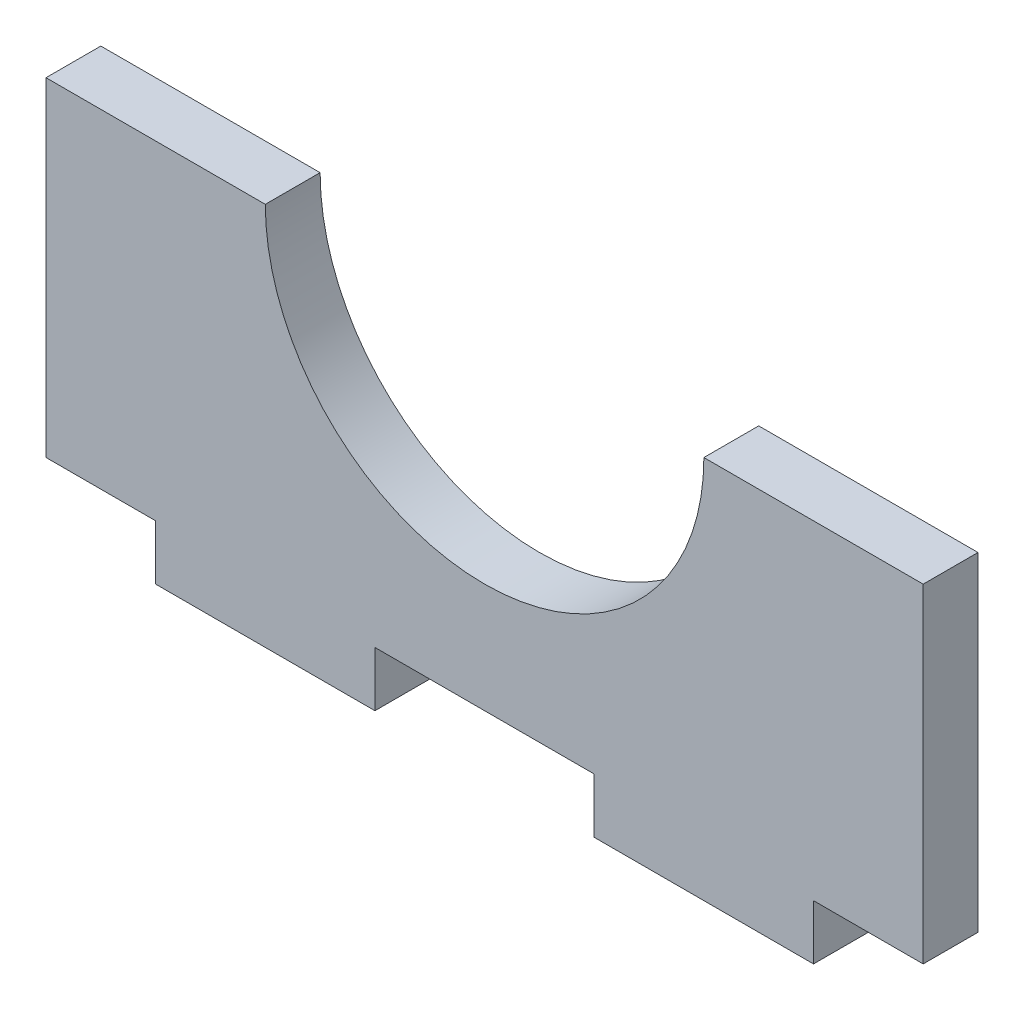
ISO-10303-21;
HEADER;
FILE_DESCRIPTION(('STEP AP214'),'2;1');
FILE_NAME('part.step','',(''),(''),'','','');
FILE_SCHEMA(('AUTOMOTIVE_DESIGN { 1 0 10303 214 1 1 1 1 }'));
ENDSEC;
DATA;
#1=APPLICATION_CONTEXT('core data for automotive mechanical design processes');
#2=APPLICATION_PROTOCOL_DEFINITION('international standard','automotive_design',2000,#1);
#3=PRODUCT_CONTEXT('',#1,'mechanical');
#4=PRODUCT('Part','Part','',(#3));
#5=PRODUCT_RELATED_PRODUCT_CATEGORY('part','',(#4));
#6=PRODUCT_DEFINITION_FORMATION('','',#4);
#7=PRODUCT_DEFINITION_CONTEXT('part definition',#1,'design');
#8=PRODUCT_DEFINITION('design','',#6,#7);
#9=PRODUCT_DEFINITION_SHAPE('','',#8);
#10=(LENGTH_UNIT() NAMED_UNIT(*) SI_UNIT(.MILLI.,.METRE.));
#11=(NAMED_UNIT(*) PLANE_ANGLE_UNIT() SI_UNIT($,.RADIAN.));
#12=(NAMED_UNIT(*) SI_UNIT($,.STERADIAN.) SOLID_ANGLE_UNIT());
#13=UNCERTAINTY_MEASURE_WITH_UNIT(LENGTH_MEASURE(1.E-05),#10,'distance_accuracy_value','');
#14=(GEOMETRIC_REPRESENTATION_CONTEXT(3) GLOBAL_UNCERTAINTY_ASSIGNED_CONTEXT((#13)) GLOBAL_UNIT_ASSIGNED_CONTEXT((#10,
#11,#12)) REPRESENTATION_CONTEXT('',''));
#15=CARTESIAN_POINT('',(0.,0.,0.));
#16=DIRECTION('',(0.,0.,1.));
#17=DIRECTION('',(1.,0.,0.));
#18=AXIS2_PLACEMENT_3D('',#15,#16,#17);
#19=CARTESIAN_POINT('',(0.,0.,3.175));
#20=DIRECTION('',(0.,0.,-1.));
#21=DIRECTION('',(-1.,0.,0.));
#22=AXIS2_PLACEMENT_3D('',#19,#20,#21);
#23=CYLINDRICAL_SURFACE('',#22,12.7);
#24=CARTESIAN_POINT('',(0.,0.,0.));
#25=DIRECTION('',(0.,0.,-1.));
#26=DIRECTION('',(-1.,0.,0.));
#27=AXIS2_PLACEMENT_3D('',#24,#25,#26);
#28=CIRCLE('',#27,12.7);
#29=CARTESIAN_POINT('',(12.7,0.,0.));
#30=VERTEX_POINT('',#29);
#31=CARTESIAN_POINT('',(-12.7,0.,0.));
#32=VERTEX_POINT('',#31);
#33=EDGE_CURVE('E165',#30,#32,#28,.T.);
#34=ORIENTED_EDGE('',*,*,#33,.T.);
#35=DIRECTION('',(0.,0.,-1.));
#36=VECTOR('',#35,1.);
#37=CARTESIAN_POINT('',(-12.7,0.,3.175));
#38=LINE('',#37,#36);
#39=CARTESIAN_POINT('',(-12.7,0.,3.175));
#40=VERTEX_POINT('',#39);
#41=EDGE_CURVE('E11',#40,#32,#38,.T.);
#42=ORIENTED_EDGE('',*,*,#41,.F.);
#43=CARTESIAN_POINT('',(0.,0.,3.175));
#44=DIRECTION('',(0.,0.,-1.));
#45=DIRECTION('',(-1.,0.,0.));
#46=AXIS2_PLACEMENT_3D('',#43,#44,#45);
#47=CIRCLE('',#46,12.7);
#48=CARTESIAN_POINT('',(12.7,0.,3.175));
#49=VERTEX_POINT('',#48);
#50=EDGE_CURVE('E191',#49,#40,#47,.T.);
#51=ORIENTED_EDGE('',*,*,#50,.F.);
#52=DIRECTION('',(0.,0.,-1.));
#53=VECTOR('',#52,1.);
#54=CARTESIAN_POINT('',(12.7,0.,3.175));
#55=LINE('',#54,#53);
#56=EDGE_CURVE('E161',#49,#30,#55,.T.);
#57=ORIENTED_EDGE('',*,*,#56,.T.);
#58=EDGE_LOOP('',(#34,#42,#51,#57));
#59=FACE_BOUND('',#58,.T.);
#60=ADVANCED_FACE('F33',(#59),#23,.F.);
#61=CARTESIAN_POINT('',(-12.7,0.,3.175));
#62=DIRECTION('',(0.,-1.,0.));
#63=DIRECTION('',(1.,0.,0.));
#64=AXIS2_PLACEMENT_3D('',#61,#62,#63);
#65=PLANE('',#64);
#66=DIRECTION('',(-1.,0.,0.));
#67=VECTOR('',#66,1.);
#68=CARTESIAN_POINT('',(-12.7,0.,0.));
#69=LINE('',#68,#67);
#70=CARTESIAN_POINT('',(-25.4,0.,0.));
#71=VERTEX_POINT('',#70);
#72=EDGE_CURVE('E168',#32,#71,#69,.T.);
#73=ORIENTED_EDGE('',*,*,#72,.T.);
#74=DIRECTION('',(0.,0.,-1.));
#75=VECTOR('',#74,1.);
#76=CARTESIAN_POINT('',(-25.4,0.,3.175));
#77=LINE('',#76,#75);
#78=CARTESIAN_POINT('',(-25.4,0.,3.175));
#79=VERTEX_POINT('',#78);
#80=EDGE_CURVE('E41',#79,#71,#77,.T.);
#81=ORIENTED_EDGE('',*,*,#80,.F.);
#82=DIRECTION('',(-1.,0.,0.));
#83=VECTOR('',#82,1.);
#84=CARTESIAN_POINT('',(-12.7,0.,3.175));
#85=LINE('',#84,#83);
#86=EDGE_CURVE('E110',#40,#79,#85,.T.);
#87=ORIENTED_EDGE('',*,*,#86,.F.);
#88=ORIENTED_EDGE('',*,*,#41,.T.);
#89=EDGE_LOOP('',(#73,#81,#87,#88));
#90=FACE_BOUND('',#89,.T.);
#91=ADVANCED_FACE('F279',(#90),#65,.F.);
#92=CARTESIAN_POINT('',(-25.4,0.,3.175));
#93=DIRECTION('',(1.,0.,0.));
#94=DIRECTION('',(0.,1.,0.));
#95=AXIS2_PLACEMENT_3D('',#92,#93,#94);
#96=PLANE('',#95);
#97=DIRECTION('',(0.,-1.,0.));
#98=VECTOR('',#97,1.);
#99=CARTESIAN_POINT('',(-25.4,0.,0.));
#100=LINE('',#99,#98);
#101=CARTESIAN_POINT('',(-25.4,-19.05,0.));
#102=VERTEX_POINT('',#101);
#103=EDGE_CURVE('E170',#71,#102,#100,.T.);
#104=ORIENTED_EDGE('',*,*,#103,.T.);
#105=DIRECTION('',(0.,0.,-1.));
#106=VECTOR('',#105,1.);
#107=CARTESIAN_POINT('',(-25.4,-19.05,3.175));
#108=LINE('',#107,#106);
#109=CARTESIAN_POINT('',(-25.4,-19.05,3.175));
#110=VERTEX_POINT('',#109);
#111=EDGE_CURVE('E216',#110,#102,#108,.T.);
#112=ORIENTED_EDGE('',*,*,#111,.F.);
#113=DIRECTION('',(0.,-1.,0.));
#114=VECTOR('',#113,1.);
#115=CARTESIAN_POINT('',(-25.4,0.,3.175));
#116=LINE('',#115,#114);
#117=EDGE_CURVE('E224',#79,#110,#116,.T.);
#118=ORIENTED_EDGE('',*,*,#117,.F.);
#119=ORIENTED_EDGE('',*,*,#80,.T.);
#120=EDGE_LOOP('',(#104,#112,#118,#119));
#121=FACE_BOUND('',#120,.T.);
#122=ADVANCED_FACE('F222',(#121),#96,.F.);
#123=CARTESIAN_POINT('',(-25.4,-19.05,3.175));
#124=DIRECTION('',(0.,1.,0.));
#125=DIRECTION('',(-1.,0.,0.));
#126=AXIS2_PLACEMENT_3D('',#123,#124,#125);
#127=PLANE('',#126);
#128=DIRECTION('',(1.,0.,0.));
#129=VECTOR('',#128,1.);
#130=CARTESIAN_POINT('',(-25.4,-19.05,0.));
#131=LINE('',#130,#129);
#132=CARTESIAN_POINT('',(-19.05,-19.05,0.));
#133=VERTEX_POINT('',#132);
#134=EDGE_CURVE('E172',#102,#133,#131,.T.);
#135=ORIENTED_EDGE('',*,*,#134,.T.);
#136=DIRECTION('',(0.,0.,-1.));
#137=VECTOR('',#136,1.);
#138=CARTESIAN_POINT('',(-19.05,-19.05,3.175));
#139=LINE('',#138,#137);
#140=CARTESIAN_POINT('',(-19.05,-19.05,3.175));
#141=VERTEX_POINT('',#140);
#142=EDGE_CURVE('E213',#141,#133,#139,.T.);
#143=ORIENTED_EDGE('',*,*,#142,.F.);
#144=DIRECTION('',(1.,0.,0.));
#145=VECTOR('',#144,1.);
#146=CARTESIAN_POINT('',(-25.4,-19.05,3.175));
#147=LINE('',#146,#145);
#148=EDGE_CURVE('E242',#110,#141,#147,.T.);
#149=ORIENTED_EDGE('',*,*,#148,.F.);
#150=ORIENTED_EDGE('',*,*,#111,.T.);
#151=EDGE_LOOP('',(#135,#143,#149,#150));
#152=FACE_BOUND('',#151,.T.);
#153=ADVANCED_FACE('F233',(#152),#127,.F.);
#154=CARTESIAN_POINT('',(-19.05,-19.05,3.175));
#155=DIRECTION('',(1.,0.,0.));
#156=DIRECTION('',(0.,0.,-1.));
#157=AXIS2_PLACEMENT_3D('',#154,#155,#156);
#158=PLANE('',#157);
#159=DIRECTION('',(0.,-1.,0.));
#160=VECTOR('',#159,1.);
#161=CARTESIAN_POINT('',(-19.05,-19.05,0.));
#162=LINE('',#161,#160);
#163=CARTESIAN_POINT('',(-19.05,-22.225,0.));
#164=VERTEX_POINT('',#163);
#165=EDGE_CURVE('E174',#133,#164,#162,.T.);
#166=ORIENTED_EDGE('',*,*,#165,.T.);
#167=DIRECTION('',(0.,0.,-1.));
#168=VECTOR('',#167,1.);
#169=CARTESIAN_POINT('',(-19.05,-22.225,3.175));
#170=LINE('',#169,#168);
#171=CARTESIAN_POINT('',(-19.05,-22.225,3.175));
#172=VERTEX_POINT('',#171);
#173=EDGE_CURVE('E210',#172,#164,#170,.T.);
#174=ORIENTED_EDGE('',*,*,#173,.F.);
#175=DIRECTION('',(0.,-1.,0.));
#176=VECTOR('',#175,1.);
#177=CARTESIAN_POINT('',(-19.05,-19.05,3.175));
#178=LINE('',#177,#176);
#179=EDGE_CURVE('E239',#141,#172,#178,.T.);
#180=ORIENTED_EDGE('',*,*,#179,.F.);
#181=ORIENTED_EDGE('',*,*,#142,.T.);
#182=EDGE_LOOP('',(#166,#174,#180,#181));
#183=FACE_BOUND('',#182,.T.);
#184=ADVANCED_FACE('F237',(#183),#158,.F.);
#185=CARTESIAN_POINT('',(-19.05,-22.225,3.175));
#186=DIRECTION('',(0.,1.,0.));
#187=DIRECTION('',(0.,0.,1.));
#188=AXIS2_PLACEMENT_3D('',#185,#186,#187);
#189=PLANE('',#188);
#190=DIRECTION('',(1.,0.,0.));
#191=VECTOR('',#190,1.);
#192=CARTESIAN_POINT('',(-19.05,-22.225,0.));
#193=LINE('',#192,#191);
#194=CARTESIAN_POINT('',(-6.35,-22.225,0.));
#195=VERTEX_POINT('',#194);
#196=EDGE_CURVE('E176',#164,#195,#193,.T.);
#197=ORIENTED_EDGE('',*,*,#196,.T.);
#198=DIRECTION('',(0.,0.,-1.));
#199=VECTOR('',#198,1.);
#200=CARTESIAN_POINT('',(-6.35,-22.225,3.175));
#201=LINE('',#200,#199);
#202=CARTESIAN_POINT('',(-6.35,-22.225,3.175));
#203=VERTEX_POINT('',#202);
#204=EDGE_CURVE('E207',#203,#195,#201,.T.);
#205=ORIENTED_EDGE('',*,*,#204,.F.);
#206=DIRECTION('',(1.,0.,0.));
#207=VECTOR('',#206,1.);
#208=CARTESIAN_POINT('',(-19.05,-22.225,3.175));
#209=LINE('',#208,#207);
#210=EDGE_CURVE('E241',#172,#203,#209,.T.);
#211=ORIENTED_EDGE('',*,*,#210,.F.);
#212=ORIENTED_EDGE('',*,*,#173,.T.);
#213=EDGE_LOOP('',(#197,#205,#211,#212));
#214=FACE_BOUND('',#213,.T.);
#215=ADVANCED_FACE('F292',(#214),#189,.F.);
#216=CARTESIAN_POINT('',(-6.35,-22.225,3.175));
#217=DIRECTION('',(-1.,0.,0.));
#218=DIRECTION('',(0.,0.,1.));
#219=AXIS2_PLACEMENT_3D('',#216,#217,#218);
#220=PLANE('',#219);
#221=DIRECTION('',(0.,1.,0.));
#222=VECTOR('',#221,1.);
#223=CARTESIAN_POINT('',(-6.35,-22.225,0.));
#224=LINE('',#223,#222);
#225=CARTESIAN_POINT('',(-6.35,-19.05,0.));
#226=VERTEX_POINT('',#225);
#227=EDGE_CURVE('E178',#195,#226,#224,.T.);
#228=ORIENTED_EDGE('',*,*,#227,.T.);
#229=DIRECTION('',(0.,0.,-1.));
#230=VECTOR('',#229,1.);
#231=CARTESIAN_POINT('',(-6.35,-19.05,3.175));
#232=LINE('',#231,#230);
#233=CARTESIAN_POINT('',(-6.35,-19.05,3.175));
#234=VERTEX_POINT('',#233);
#235=EDGE_CURVE('E204',#234,#226,#232,.T.);
#236=ORIENTED_EDGE('',*,*,#235,.F.);
#237=DIRECTION('',(0.,1.,0.));
#238=VECTOR('',#237,1.);
#239=CARTESIAN_POINT('',(-6.35,-22.225,3.175));
#240=LINE('',#239,#238);
#241=EDGE_CURVE('E244',#203,#234,#240,.T.);
#242=ORIENTED_EDGE('',*,*,#241,.F.);
#243=ORIENTED_EDGE('',*,*,#204,.T.);
#244=EDGE_LOOP('',(#228,#236,#242,#243));
#245=FACE_BOUND('',#244,.T.);
#246=ADVANCED_FACE('F295',(#245),#220,.F.);
#247=CARTESIAN_POINT('',(-6.35,-19.05,3.175));
#248=DIRECTION('',(0.,1.,0.));
#249=DIRECTION('',(0.,0.,1.));
#250=AXIS2_PLACEMENT_3D('',#247,#248,#249);
#251=PLANE('',#250);
#252=DIRECTION('',(1.,0.,0.));
#253=VECTOR('',#252,1.);
#254=CARTESIAN_POINT('',(-6.35,-19.05,0.));
#255=LINE('',#254,#253);
#256=CARTESIAN_POINT('',(6.35,-19.05,0.));
#257=VERTEX_POINT('',#256);
#258=EDGE_CURVE('E180',#226,#257,#255,.T.);
#259=ORIENTED_EDGE('',*,*,#258,.T.);
#260=DIRECTION('',(0.,0.,-1.));
#261=VECTOR('',#260,1.);
#262=CARTESIAN_POINT('',(6.35,-19.05,3.175));
#263=LINE('',#262,#261);
#264=CARTESIAN_POINT('',(6.35,-19.05,3.175));
#265=VERTEX_POINT('',#264);
#266=EDGE_CURVE('E201',#265,#257,#263,.T.);
#267=ORIENTED_EDGE('',*,*,#266,.F.);
#268=DIRECTION('',(1.,0.,0.));
#269=VECTOR('',#268,1.);
#270=CARTESIAN_POINT('',(-6.35,-19.05,3.175));
#271=LINE('',#270,#269);
#272=EDGE_CURVE('E250',#234,#265,#271,.T.);
#273=ORIENTED_EDGE('',*,*,#272,.F.);
#274=ORIENTED_EDGE('',*,*,#235,.T.);
#275=EDGE_LOOP('',(#259,#267,#273,#274));
#276=FACE_BOUND('',#275,.T.);
#277=ADVANCED_FACE('F299',(#276),#251,.F.);
#278=CARTESIAN_POINT('',(6.35,-19.05,3.175));
#279=DIRECTION('',(1.,0.,0.));
#280=DIRECTION('',(0.,0.,-1.));
#281=AXIS2_PLACEMENT_3D('',#278,#279,#280);
#282=PLANE('',#281);
#283=DIRECTION('',(0.,-1.,0.));
#284=VECTOR('',#283,1.);
#285=CARTESIAN_POINT('',(6.35,-19.05,0.));
#286=LINE('',#285,#284);
#287=CARTESIAN_POINT('',(6.35,-22.225,0.));
#288=VERTEX_POINT('',#287);
#289=EDGE_CURVE('E182',#257,#288,#286,.T.);
#290=ORIENTED_EDGE('',*,*,#289,.T.);
#291=DIRECTION('',(0.,0.,-1.));
#292=VECTOR('',#291,1.);
#293=CARTESIAN_POINT('',(6.35,-22.225,3.175));
#294=LINE('',#293,#292);
#295=CARTESIAN_POINT('',(6.35,-22.225,3.175));
#296=VERTEX_POINT('',#295);
#297=EDGE_CURVE('E198',#296,#288,#294,.T.);
#298=ORIENTED_EDGE('',*,*,#297,.F.);
#299=DIRECTION('',(0.,-1.,0.));
#300=VECTOR('',#299,1.);
#301=CARTESIAN_POINT('',(6.35,-19.05,3.175));
#302=LINE('',#301,#300);
#303=EDGE_CURVE('E252',#265,#296,#302,.T.);
#304=ORIENTED_EDGE('',*,*,#303,.F.);
#305=ORIENTED_EDGE('',*,*,#266,.T.);
#306=EDGE_LOOP('',(#290,#298,#304,#305));
#307=FACE_BOUND('',#306,.T.);
#308=ADVANCED_FACE('F303',(#307),#282,.F.);
#309=CARTESIAN_POINT('',(19.05,-22.225,3.175));
#310=DIRECTION('',(0.,1.,0.));
#311=DIRECTION('',(0.,0.,1.));
#312=AXIS2_PLACEMENT_3D('',#309,#310,#311);
#313=PLANE('',#312);
#314=DIRECTION('',(1.,0.,0.));
#315=VECTOR('',#314,1.);
#316=CARTESIAN_POINT('',(19.05,-22.225,0.));
#317=LINE('',#316,#315);
#318=CARTESIAN_POINT('',(19.05,-22.225,0.));
#319=VERTEX_POINT('',#318);
#320=EDGE_CURVE('E184',#288,#319,#317,.T.);
#321=ORIENTED_EDGE('',*,*,#320,.T.);
#322=DIRECTION('',(0.,0.,-1.));
#323=VECTOR('',#322,1.);
#324=CARTESIAN_POINT('',(19.05,-22.225,3.175));
#325=LINE('',#324,#323);
#326=CARTESIAN_POINT('',(19.05,-22.225,3.175));
#327=VERTEX_POINT('',#326);
#328=EDGE_CURVE('E195',#327,#319,#325,.T.);
#329=ORIENTED_EDGE('',*,*,#328,.F.);
#330=DIRECTION('',(1.,0.,0.));
#331=VECTOR('',#330,1.);
#332=CARTESIAN_POINT('',(19.05,-22.225,3.175));
#333=LINE('',#332,#331);
#334=EDGE_CURVE('E254',#296,#327,#333,.T.);
#335=ORIENTED_EDGE('',*,*,#334,.F.);
#336=ORIENTED_EDGE('',*,*,#297,.T.);
#337=EDGE_LOOP('',(#321,#329,#335,#336));
#338=FACE_BOUND('',#337,.T.);
#339=ADVANCED_FACE('F260',(#338),#313,.F.);
#340=CARTESIAN_POINT('',(19.05,-19.05,3.175));
#341=DIRECTION('',(-1.,0.,0.));
#342=DIRECTION('',(0.,0.,1.));
#343=AXIS2_PLACEMENT_3D('',#340,#341,#342);
#344=PLANE('',#343);
#345=DIRECTION('',(0.,1.,0.));
#346=VECTOR('',#345,1.);
#347=CARTESIAN_POINT('',(19.05,-19.05,0.));
#348=LINE('',#347,#346);
#349=CARTESIAN_POINT('',(19.05,-19.05,0.));
#350=VERTEX_POINT('',#349);
#351=EDGE_CURVE('E186',#319,#350,#348,.T.);
#352=ORIENTED_EDGE('',*,*,#351,.T.);
#353=DIRECTION('',(0.,0.,-1.));
#354=VECTOR('',#353,1.);
#355=CARTESIAN_POINT('',(19.05,-19.05,3.175));
#356=LINE('',#355,#354);
#357=CARTESIAN_POINT('',(19.05,-19.05,3.175));
#358=VERTEX_POINT('',#357);
#359=EDGE_CURVE('E156',#358,#350,#356,.T.);
#360=ORIENTED_EDGE('',*,*,#359,.F.);
#361=DIRECTION('',(0.,1.,0.));
#362=VECTOR('',#361,1.);
#363=CARTESIAN_POINT('',(19.05,-19.05,3.175));
#364=LINE('',#363,#362);
#365=EDGE_CURVE('E147',#327,#358,#364,.T.);
#366=ORIENTED_EDGE('',*,*,#365,.F.);
#367=ORIENTED_EDGE('',*,*,#328,.T.);
#368=EDGE_LOOP('',(#352,#360,#366,#367));
#369=FACE_BOUND('',#368,.T.);
#370=ADVANCED_FACE('F264',(#369),#344,.F.);
#371=CARTESIAN_POINT('',(25.4,-19.05,3.175));
#372=DIRECTION('',(0.,1.,0.));
#373=DIRECTION('',(-1.,0.,0.));
#374=AXIS2_PLACEMENT_3D('',#371,#372,#373);
#375=PLANE('',#374);
#376=DIRECTION('',(1.,0.,0.));
#377=VECTOR('',#376,1.);
#378=CARTESIAN_POINT('',(25.4,-19.05,0.));
#379=LINE('',#378,#377);
#380=CARTESIAN_POINT('',(25.4,-19.05,0.));
#381=VERTEX_POINT('',#380);
#382=EDGE_CURVE('E155',#350,#381,#379,.T.);
#383=ORIENTED_EDGE('',*,*,#382,.T.);
#384=DIRECTION('',(0.,0.,-1.));
#385=VECTOR('',#384,1.);
#386=CARTESIAN_POINT('',(25.4,-19.05,3.175));
#387=LINE('',#386,#385);
#388=CARTESIAN_POINT('',(25.4,-19.05,3.175));
#389=VERTEX_POINT('',#388);
#390=EDGE_CURVE('E152',#389,#381,#387,.T.);
#391=ORIENTED_EDGE('',*,*,#390,.F.);
#392=DIRECTION('',(1.,0.,0.));
#393=VECTOR('',#392,1.);
#394=CARTESIAN_POINT('',(25.4,-19.05,3.175));
#395=LINE('',#394,#393);
#396=EDGE_CURVE('E141',#358,#389,#395,.T.);
#397=ORIENTED_EDGE('',*,*,#396,.F.);
#398=ORIENTED_EDGE('',*,*,#359,.T.);
#399=EDGE_LOOP('',(#383,#391,#397,#398));
#400=FACE_BOUND('',#399,.T.);
#401=ADVANCED_FACE('F153',(#400),#375,.F.);
#402=CARTESIAN_POINT('',(25.4,-19.05,3.175));
#403=DIRECTION('',(-1.,0.,0.));
#404=DIRECTION('',(0.,-1.,0.));
#405=AXIS2_PLACEMENT_3D('',#402,#403,#404);
#406=PLANE('',#405);
#407=DIRECTION('',(0.,1.,0.));
#408=VECTOR('',#407,1.);
#409=CARTESIAN_POINT('',(25.4,-19.05,0.));
#410=LINE('',#409,#408);
#411=CARTESIAN_POINT('',(25.4,0.,0.));
#412=VERTEX_POINT('',#411);
#413=EDGE_CURVE('E96',#381,#412,#410,.T.);
#414=ORIENTED_EDGE('',*,*,#413,.T.);
#415=DIRECTION('',(0.,0.,-1.));
#416=VECTOR('',#415,1.);
#417=CARTESIAN_POINT('',(25.4,0.,3.175));
#418=LINE('',#417,#416);
#419=CARTESIAN_POINT('',(25.4,0.,3.175));
#420=VERTEX_POINT('',#419);
#421=EDGE_CURVE('E157',#420,#412,#418,.T.);
#422=ORIENTED_EDGE('',*,*,#421,.F.);
#423=DIRECTION('',(0.,1.,0.));
#424=VECTOR('',#423,1.);
#425=CARTESIAN_POINT('',(25.4,-19.05,3.175));
#426=LINE('',#425,#424);
#427=EDGE_CURVE('E145',#389,#420,#426,.T.);
#428=ORIENTED_EDGE('',*,*,#427,.F.);
#429=ORIENTED_EDGE('',*,*,#390,.T.);
#430=EDGE_LOOP('',(#414,#422,#428,#429));
#431=FACE_BOUND('',#430,.T.);
#432=ADVANCED_FACE('F159',(#431),#406,.F.);
#433=CARTESIAN_POINT('',(25.4,0.,3.175));
#434=DIRECTION('',(0.,-1.,0.));
#435=DIRECTION('',(1.,0.,0.));
#436=AXIS2_PLACEMENT_3D('',#433,#434,#435);
#437=PLANE('',#436);
#438=DIRECTION('',(-1.,0.,0.));
#439=VECTOR('',#438,1.);
#440=CARTESIAN_POINT('',(25.4,0.,0.));
#441=LINE('',#440,#439);
#442=EDGE_CURVE('E102',#412,#30,#441,.T.);
#443=ORIENTED_EDGE('',*,*,#442,.T.);
#444=ORIENTED_EDGE('',*,*,#56,.F.);
#445=DIRECTION('',(-1.,0.,0.));
#446=VECTOR('',#445,1.);
#447=CARTESIAN_POINT('',(25.4,0.,3.175));
#448=LINE('',#447,#446);
#449=EDGE_CURVE('E49',#420,#49,#448,.T.);
#450=ORIENTED_EDGE('',*,*,#449,.F.);
#451=ORIENTED_EDGE('',*,*,#421,.T.);
#452=EDGE_LOOP('',(#443,#444,#450,#451));
#453=FACE_BOUND('',#452,.T.);
#454=ADVANCED_FACE('F268',(#453),#437,.F.);
#455=CARTESIAN_POINT('',(0.,0.,3.175));
#456=DIRECTION('',(0.,0.,-1.));
#457=DIRECTION('',(-1.,0.,0.));
#458=AXIS2_PLACEMENT_3D('',#455,#456,#457);
#459=PLANE('',#458);
#460=ORIENTED_EDGE('',*,*,#50,.T.);
#461=ORIENTED_EDGE('',*,*,#86,.T.);
#462=ORIENTED_EDGE('',*,*,#117,.T.);
#463=ORIENTED_EDGE('',*,*,#148,.T.);
#464=ORIENTED_EDGE('',*,*,#179,.T.);
#465=ORIENTED_EDGE('',*,*,#210,.T.);
#466=ORIENTED_EDGE('',*,*,#241,.T.);
#467=ORIENTED_EDGE('',*,*,#272,.T.);
#468=ORIENTED_EDGE('',*,*,#303,.T.);
#469=ORIENTED_EDGE('',*,*,#334,.T.);
#470=ORIENTED_EDGE('',*,*,#365,.T.);
#471=ORIENTED_EDGE('',*,*,#396,.T.);
#472=ORIENTED_EDGE('',*,*,#427,.T.);
#473=ORIENTED_EDGE('',*,*,#449,.T.);
#474=EDGE_LOOP('',(#460,#461,#462,#463,#464,#465,#466,#467,#468,#469,#470,#471,#472,#473));
#475=FACE_BOUND('',#474,.T.);
#476=ADVANCED_FACE('F143',(#475),#459,.F.);
#477=CARTESIAN_POINT('',(0.,0.,0.));
#478=DIRECTION('',(0.,0.,-1.));
#479=DIRECTION('',(-1.,0.,0.));
#480=AXIS2_PLACEMENT_3D('',#477,#478,#479);
#481=PLANE('',#480);
#482=ORIENTED_EDGE('',*,*,#33,.F.);
#483=ORIENTED_EDGE('',*,*,#442,.F.);
#484=ORIENTED_EDGE('',*,*,#413,.F.);
#485=ORIENTED_EDGE('',*,*,#382,.F.);
#486=ORIENTED_EDGE('',*,*,#351,.F.);
#487=ORIENTED_EDGE('',*,*,#320,.F.);
#488=ORIENTED_EDGE('',*,*,#289,.F.);
#489=ORIENTED_EDGE('',*,*,#258,.F.);
#490=ORIENTED_EDGE('',*,*,#227,.F.);
#491=ORIENTED_EDGE('',*,*,#196,.F.);
#492=ORIENTED_EDGE('',*,*,#165,.F.);
#493=ORIENTED_EDGE('',*,*,#134,.F.);
#494=ORIENTED_EDGE('',*,*,#103,.F.);
#495=ORIENTED_EDGE('',*,*,#72,.F.);
#496=EDGE_LOOP('',(#482,#483,#484,#485,#486,#487,#488,#489,#490,#491,#492,#493,#494,#495));
#497=FACE_BOUND('',#496,.T.);
#498=ADVANCED_FACE('F228',(#497),#481,.T.);
#499=CLOSED_SHELL('',(#60,#91,#122,#153,#184,#215,#246,#277,#308,#339,#370,#401,#432,#454,#476,#498));
#500=MANIFOLD_SOLID_BREP('B2',#499);
#501=ADVANCED_BREP_SHAPE_REPRESENTATION('',(#18,#500),#14);
#502=SHAPE_DEFINITION_REPRESENTATION(#9,#501);
ENDSEC;
END-ISO-10303-21;
